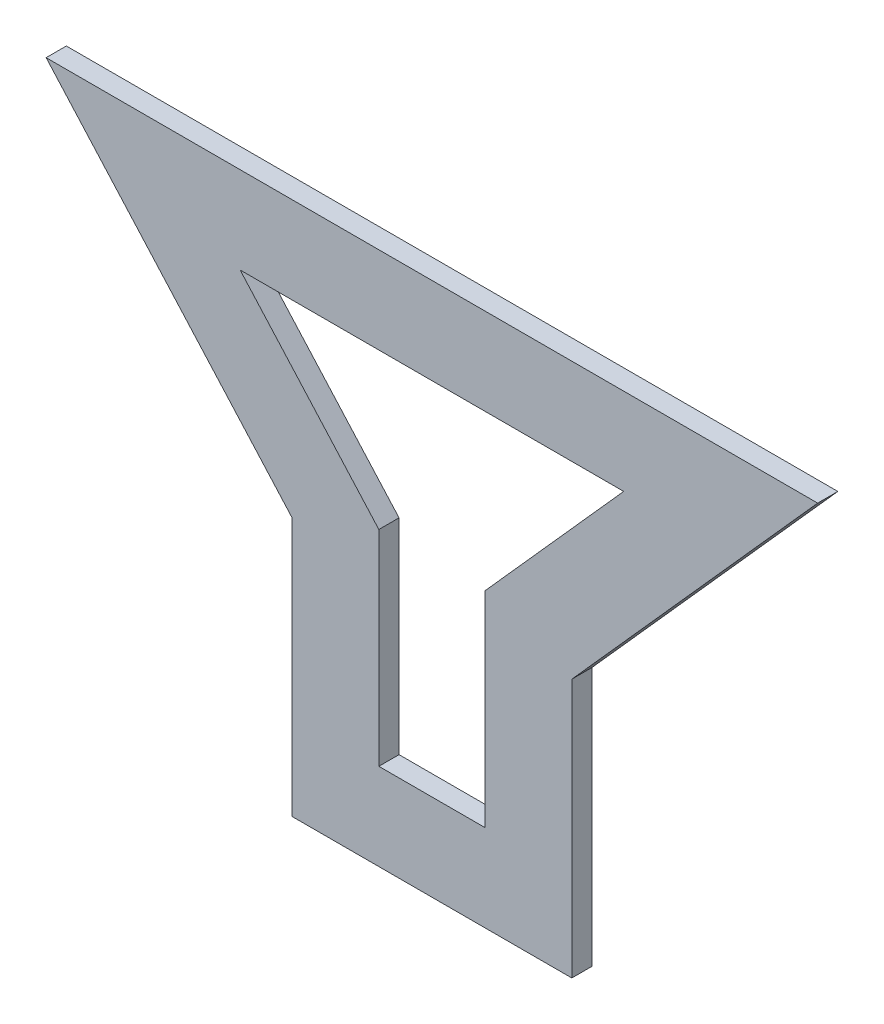
ISO-10303-21;
HEADER;
FILE_DESCRIPTION(('STEP AP214'),'2;1');
FILE_NAME('part.step','',(''),(''),'','','');
FILE_SCHEMA(('AUTOMOTIVE_DESIGN { 1 0 10303 214 1 1 1 1 }'));
ENDSEC;
DATA;
#1=APPLICATION_CONTEXT('core data for automotive mechanical design processes');
#2=APPLICATION_PROTOCOL_DEFINITION('international standard','automotive_design',2000,#1);
#3=PRODUCT_CONTEXT('',#1,'mechanical');
#4=PRODUCT('Part','Part','',(#3));
#5=PRODUCT_RELATED_PRODUCT_CATEGORY('part','',(#4));
#6=PRODUCT_DEFINITION_FORMATION('','',#4);
#7=PRODUCT_DEFINITION_CONTEXT('part definition',#1,'design');
#8=PRODUCT_DEFINITION('design','',#6,#7);
#9=PRODUCT_DEFINITION_SHAPE('','',#8);
#10=(LENGTH_UNIT() NAMED_UNIT(*) SI_UNIT(.MILLI.,.METRE.));
#11=(NAMED_UNIT(*) PLANE_ANGLE_UNIT() SI_UNIT($,.RADIAN.));
#12=(NAMED_UNIT(*) SI_UNIT($,.STERADIAN.) SOLID_ANGLE_UNIT());
#13=UNCERTAINTY_MEASURE_WITH_UNIT(LENGTH_MEASURE(1.E-05),#10,'distance_accuracy_value','');
#14=(GEOMETRIC_REPRESENTATION_CONTEXT(3) GLOBAL_UNCERTAINTY_ASSIGNED_CONTEXT((#13)) GLOBAL_UNIT_ASSIGNED_CONTEXT((#10,
#11,#12)) REPRESENTATION_CONTEXT('',''));
#15=CARTESIAN_POINT('',(0.,0.,0.));
#16=DIRECTION('',(0.,0.,1.));
#17=DIRECTION('',(1.,0.,0.));
#18=AXIS2_PLACEMENT_3D('',#15,#16,#17);
#19=CARTESIAN_POINT('',(0.,0.,10.));
#20=DIRECTION('',(0.,0.,-1.));
#21=DIRECTION('',(-1.,0.,0.));
#22=AXIS2_PLACEMENT_3D('',#19,#20,#21);
#23=PLANE('',#22);
#24=DIRECTION('',(0.,-1.,0.));
#25=VECTOR('',#24,1.);
#26=CARTESIAN_POINT('',(69.2702640138782,2.53280531523941,10.));
#27=LINE('',#26,#25);
#28=CARTESIAN_POINT('',(69.2702640138782,2.53280531523941,10.));
#29=VERTEX_POINT('',#28);
#30=CARTESIAN_POINT('',(69.2702640138782,-125.601784109811,10.));
#31=VERTEX_POINT('',#30);
#32=EDGE_CURVE('E236',#29,#31,#27,.T.);
#33=ORIENTED_EDGE('',*,*,#32,.F.);
#34=DIRECTION('',(0.665963027274692,0.745984749377042,0.));
#35=VECTOR('',#34,1.);
#36=CARTESIAN_POINT('',(69.2702640138782,2.53280531523941,10.));
#37=LINE('',#36,#35);
#38=CARTESIAN_POINT('',(190.995381487231,138.884340659251,10.));
#39=VERTEX_POINT('',#38);
#40=EDGE_CURVE('E255',#29,#39,#37,.T.);
#41=ORIENTED_EDGE('',*,*,#40,.T.);
#42=DIRECTION('',(-1.,0.,0.));
#43=VECTOR('',#42,1.);
#44=CARTESIAN_POINT('',(190.995381487231,138.884340659251,10.));
#45=LINE('',#44,#43);
#46=CARTESIAN_POINT('',(-190.995381487231,138.884340659251,10.));
#47=VERTEX_POINT('',#46);
#48=EDGE_CURVE('E252',#39,#47,#45,.T.);
#49=ORIENTED_EDGE('',*,*,#48,.T.);
#50=DIRECTION('',(-0.665963027274693,0.745984749377041,0.));
#51=VECTOR('',#50,1.);
#52=CARTESIAN_POINT('',(-69.2702640138782,2.5328053152393,10.));
#53=LINE('',#52,#51);
#54=CARTESIAN_POINT('',(-69.2702640138782,2.5328053152393,10.));
#55=VERTEX_POINT('',#54);
#56=EDGE_CURVE('E248',#55,#47,#53,.T.);
#57=ORIENTED_EDGE('',*,*,#56,.F.);
#58=DIRECTION('',(0.,-1.,0.));
#59=VECTOR('',#58,1.);
#60=CARTESIAN_POINT('',(-69.2702640138782,2.5328053152393,10.));
#61=LINE('',#60,#59);
#62=CARTESIAN_POINT('',(-69.2702640138782,-125.601784109811,10.));
#63=VERTEX_POINT('',#62);
#64=EDGE_CURVE('E245',#55,#63,#61,.T.);
#65=ORIENTED_EDGE('',*,*,#64,.T.);
#66=DIRECTION('',(-1.,0.,0.));
#67=VECTOR('',#66,1.);
#68=CARTESIAN_POINT('',(69.2702640138782,-125.601784109811,10.));
#69=LINE('',#68,#67);
#70=EDGE_CURVE('E240',#31,#63,#69,.T.);
#71=ORIENTED_EDGE('',*,*,#70,.F.);
#72=EDGE_LOOP('',(#33,#41,#49,#57,#65,#71));
#73=FACE_BOUND('',#72,.T.);
#74=DIRECTION('',(0.665963027274692,0.745984749377041,0.));
#75=VECTOR('',#74,1.);
#76=CARTESIAN_POINT('',(26.2702640138782,18.9340998758185,10.));
#77=LINE('',#76,#75);
#78=CARTESIAN_POINT('',(26.2702640138782,18.9340998758185,10.));
#79=VERTEX_POINT('',#78);
#80=CARTESIAN_POINT('',(94.9660588601479,95.8843406592509,10.));
#81=VERTEX_POINT('',#80);
#82=EDGE_CURVE('E166',#79,#81,#77,.T.);
#83=ORIENTED_EDGE('',*,*,#82,.F.);
#84=DIRECTION('',(0.,1.,0.));
#85=VECTOR('',#84,1.);
#86=CARTESIAN_POINT('',(26.2702640138782,-82.6017841098114,10.));
#87=LINE('',#86,#85);
#88=CARTESIAN_POINT('',(26.2702640138782,-82.6017841098114,10.));
#89=VERTEX_POINT('',#88);
#90=EDGE_CURVE('E202',#89,#79,#87,.T.);
#91=ORIENTED_EDGE('',*,*,#90,.F.);
#92=DIRECTION('',(1.,0.,0.));
#93=VECTOR('',#92,1.);
#94=CARTESIAN_POINT('',(-26.2702640138782,-82.6017841098114,10.));
#95=LINE('',#94,#93);
#96=CARTESIAN_POINT('',(-26.2702640138782,-82.6017841098114,10.));
#97=VERTEX_POINT('',#96);
#98=EDGE_CURVE('E199',#97,#89,#95,.T.);
#99=ORIENTED_EDGE('',*,*,#98,.F.);
#100=DIRECTION('',(0.,1.,0.));
#101=VECTOR('',#100,1.);
#102=CARTESIAN_POINT('',(-26.2702640138782,-82.6017841098114,10.));
#103=LINE('',#102,#101);
#104=CARTESIAN_POINT('',(-26.2702640138782,18.9340998758184,10.));
#105=VERTEX_POINT('',#104);
#106=EDGE_CURVE('E194',#97,#105,#103,.T.);
#107=ORIENTED_EDGE('',*,*,#106,.T.);
#108=DIRECTION('',(-0.665963027274692,0.745984749377041,0.));
#109=VECTOR('',#108,1.);
#110=CARTESIAN_POINT('',(-26.2702640138782,18.9340998758184,10.));
#111=LINE('',#110,#109);
#112=CARTESIAN_POINT('',(-94.9660588601479,95.8843406592508,10.));
#113=VERTEX_POINT('',#112);
#114=EDGE_CURVE('E190',#105,#113,#111,.T.);
#115=ORIENTED_EDGE('',*,*,#114,.T.);
#116=DIRECTION('',(-1.,0.,0.));
#117=VECTOR('',#116,1.);
#118=CARTESIAN_POINT('',(94.9660588601479,95.8843406592509,10.));
#119=LINE('',#118,#117);
#120=EDGE_CURVE('E175',#81,#113,#119,.T.);
#121=ORIENTED_EDGE('',*,*,#120,.F.);
#122=EDGE_LOOP('',(#83,#91,#99,#107,#115,#121));
#123=FACE_BOUND('',#122,.T.);
#124=ADVANCED_FACE('F75',(#73,#123),#23,.F.);
#125=CARTESIAN_POINT('',(0.,0.,0.));
#126=DIRECTION('',(0.,0.,-1.));
#127=DIRECTION('',(-1.,0.,0.));
#128=AXIS2_PLACEMENT_3D('',#125,#126,#127);
#129=PLANE('',#128);
#130=DIRECTION('',(0.,-1.,0.));
#131=VECTOR('',#130,1.);
#132=CARTESIAN_POINT('',(69.2702640138782,2.53280531523941,0.));
#133=LINE('',#132,#131);
#134=CARTESIAN_POINT('',(69.2702640138782,2.53280531523941,0.));
#135=VERTEX_POINT('',#134);
#136=CARTESIAN_POINT('',(69.2702640138782,-125.601784109811,0.));
#137=VERTEX_POINT('',#136);
#138=EDGE_CURVE('E184',#135,#137,#133,.T.);
#139=ORIENTED_EDGE('',*,*,#138,.T.);
#140=DIRECTION('',(-1.,0.,0.));
#141=VECTOR('',#140,1.);
#142=CARTESIAN_POINT('',(69.2702640138782,-125.601784109811,0.));
#143=LINE('',#142,#141);
#144=CARTESIAN_POINT('',(-69.2702640138782,-125.601784109811,0.));
#145=VERTEX_POINT('',#144);
#146=EDGE_CURVE('E261',#137,#145,#143,.T.);
#147=ORIENTED_EDGE('',*,*,#146,.T.);
#148=DIRECTION('',(0.,-1.,0.));
#149=VECTOR('',#148,1.);
#150=CARTESIAN_POINT('',(-69.2702640138782,2.5328053152393,0.));
#151=LINE('',#150,#149);
#152=CARTESIAN_POINT('',(-69.2702640138782,2.5328053152393,0.));
#153=VERTEX_POINT('',#152);
#154=EDGE_CURVE('E265',#153,#145,#151,.T.);
#155=ORIENTED_EDGE('',*,*,#154,.F.);
#156=DIRECTION('',(-0.665963027274693,0.745984749377041,0.));
#157=VECTOR('',#156,1.);
#158=CARTESIAN_POINT('',(-69.2702640138782,2.5328053152393,0.));
#159=LINE('',#158,#157);
#160=CARTESIAN_POINT('',(-190.995381487231,138.884340659251,0.));
#161=VERTEX_POINT('',#160);
#162=EDGE_CURVE('E269',#153,#161,#159,.T.);
#163=ORIENTED_EDGE('',*,*,#162,.T.);
#164=DIRECTION('',(-1.,0.,0.));
#165=VECTOR('',#164,1.);
#166=CARTESIAN_POINT('',(190.995381487231,138.884340659251,0.));
#167=LINE('',#166,#165);
#168=CARTESIAN_POINT('',(190.995381487231,138.884340659251,0.));
#169=VERTEX_POINT('',#168);
#170=EDGE_CURVE('E273',#169,#161,#167,.T.);
#171=ORIENTED_EDGE('',*,*,#170,.F.);
#172=DIRECTION('',(0.665963027274692,0.745984749377042,0.));
#173=VECTOR('',#172,1.);
#174=CARTESIAN_POINT('',(69.2702640138782,2.53280531523941,0.));
#175=LINE('',#174,#173);
#176=EDGE_CURVE('E241',#135,#169,#175,.T.);
#177=ORIENTED_EDGE('',*,*,#176,.F.);
#178=EDGE_LOOP('',(#139,#147,#155,#163,#171,#177));
#179=FACE_BOUND('',#178,.T.);
#180=DIRECTION('',(0.,1.,0.));
#181=VECTOR('',#180,1.);
#182=CARTESIAN_POINT('',(26.2702640138782,-82.6017841098114,0.));
#183=LINE('',#182,#181);
#184=CARTESIAN_POINT('',(26.2702640138782,-82.6017841098114,0.));
#185=VERTEX_POINT('',#184);
#186=CARTESIAN_POINT('',(26.2702640138782,18.9340998758185,0.));
#187=VERTEX_POINT('',#186);
#188=EDGE_CURVE('E176',#185,#187,#183,.T.);
#189=ORIENTED_EDGE('',*,*,#188,.T.);
#190=DIRECTION('',(0.665963027274692,0.745984749377041,0.));
#191=VECTOR('',#190,1.);
#192=CARTESIAN_POINT('',(26.2702640138782,18.9340998758185,0.));
#193=LINE('',#192,#191);
#194=CARTESIAN_POINT('',(94.9660588601479,95.8843406592509,0.));
#195=VERTEX_POINT('',#194);
#196=EDGE_CURVE('E101',#187,#195,#193,.T.);
#197=ORIENTED_EDGE('',*,*,#196,.T.);
#198=DIRECTION('',(-1.,0.,0.));
#199=VECTOR('',#198,1.);
#200=CARTESIAN_POINT('',(94.9660588601479,95.8843406592509,0.));
#201=LINE('',#200,#199);
#202=CARTESIAN_POINT('',(-94.9660588601479,95.8843406592508,0.));
#203=VERTEX_POINT('',#202);
#204=EDGE_CURVE('E182',#195,#203,#201,.T.);
#205=ORIENTED_EDGE('',*,*,#204,.T.);
#206=DIRECTION('',(-0.665963027274692,0.745984749377041,0.));
#207=VECTOR('',#206,1.);
#208=CARTESIAN_POINT('',(-26.2702640138782,18.9340998758184,0.));
#209=LINE('',#208,#207);
#210=CARTESIAN_POINT('',(-26.2702640138782,18.9340998758184,0.));
#211=VERTEX_POINT('',#210);
#212=EDGE_CURVE('E209',#211,#203,#209,.T.);
#213=ORIENTED_EDGE('',*,*,#212,.F.);
#214=DIRECTION('',(0.,1.,0.));
#215=VECTOR('',#214,1.);
#216=CARTESIAN_POINT('',(-26.2702640138782,-82.6017841098114,0.));
#217=LINE('',#216,#215);
#218=CARTESIAN_POINT('',(-26.2702640138782,-82.6017841098114,0.));
#219=VERTEX_POINT('',#218);
#220=EDGE_CURVE('E213',#219,#211,#217,.T.);
#221=ORIENTED_EDGE('',*,*,#220,.F.);
#222=DIRECTION('',(1.,0.,0.));
#223=VECTOR('',#222,1.);
#224=CARTESIAN_POINT('',(-26.2702640138782,-82.6017841098114,0.));
#225=LINE('',#224,#223);
#226=EDGE_CURVE('E217',#219,#185,#225,.T.);
#227=ORIENTED_EDGE('',*,*,#226,.T.);
#228=EDGE_LOOP('',(#189,#197,#205,#213,#221,#227));
#229=FACE_BOUND('',#228,.T.);
#230=ADVANCED_FACE('F301',(#179,#229),#129,.T.);
#231=CARTESIAN_POINT('',(69.2702640138782,2.53280531523941,10.));
#232=DIRECTION('',(1.,0.,0.));
#233=DIRECTION('',(0.,1.,0.));
#234=AXIS2_PLACEMENT_3D('',#231,#232,#233);
#235=PLANE('',#234);
#236=ORIENTED_EDGE('',*,*,#138,.F.);
#237=DIRECTION('',(0.,0.,-1.));
#238=VECTOR('',#237,1.);
#239=CARTESIAN_POINT('',(69.2702640138782,2.53280531523941,10.));
#240=LINE('',#239,#238);
#241=EDGE_CURVE('E12',#29,#135,#240,.T.);
#242=ORIENTED_EDGE('',*,*,#241,.F.);
#243=ORIENTED_EDGE('',*,*,#32,.T.);
#244=DIRECTION('',(0.,0.,-1.));
#245=VECTOR('',#244,1.);
#246=CARTESIAN_POINT('',(69.2702640138782,-125.601784109811,10.));
#247=LINE('',#246,#245);
#248=EDGE_CURVE('E79',#31,#137,#247,.T.);
#249=ORIENTED_EDGE('',*,*,#248,.T.);
#250=EDGE_LOOP('',(#236,#242,#243,#249));
#251=FACE_BOUND('',#250,.T.);
#252=ADVANCED_FACE('F77',(#251),#235,.T.);
#253=CARTESIAN_POINT('',(69.2702640138782,2.53280531523941,10.));
#254=DIRECTION('',(-0.745984749377042,0.665963027274692,0.));
#255=DIRECTION('',(-0.665963027274692,-0.745984749377042,0.));
#256=AXIS2_PLACEMENT_3D('',#253,#254,#255);
#257=PLANE('',#256);
#258=ORIENTED_EDGE('',*,*,#176,.T.);
#259=DIRECTION('',(0.,0.,-1.));
#260=VECTOR('',#259,1.);
#261=CARTESIAN_POINT('',(190.995381487231,138.884340659251,10.));
#262=LINE('',#261,#260);
#263=EDGE_CURVE('E85',#39,#169,#262,.T.);
#264=ORIENTED_EDGE('',*,*,#263,.F.);
#265=ORIENTED_EDGE('',*,*,#40,.F.);
#266=ORIENTED_EDGE('',*,*,#241,.T.);
#267=EDGE_LOOP('',(#258,#264,#265,#266));
#268=FACE_BOUND('',#267,.T.);
#269=ADVANCED_FACE('F306',(#268),#257,.F.);
#270=CARTESIAN_POINT('',(190.995381487231,138.884340659251,10.));
#271=DIRECTION('',(0.,-1.,0.));
#272=DIRECTION('',(1.,0.,0.));
#273=AXIS2_PLACEMENT_3D('',#270,#271,#272);
#274=PLANE('',#273);
#275=ORIENTED_EDGE('',*,*,#170,.T.);
#276=DIRECTION('',(0.,0.,-1.));
#277=VECTOR('',#276,1.);
#278=CARTESIAN_POINT('',(-190.995381487231,138.884340659251,10.));
#279=LINE('',#278,#277);
#280=EDGE_CURVE('E282',#47,#161,#279,.T.);
#281=ORIENTED_EDGE('',*,*,#280,.F.);
#282=ORIENTED_EDGE('',*,*,#48,.F.);
#283=ORIENTED_EDGE('',*,*,#263,.T.);
#284=EDGE_LOOP('',(#275,#281,#282,#283));
#285=FACE_BOUND('',#284,.T.);
#286=ADVANCED_FACE('F310',(#285),#274,.F.);
#287=CARTESIAN_POINT('',(-69.2702640138782,2.5328053152393,10.));
#288=DIRECTION('',(-0.745984749377041,-0.665963027274693,0.));
#289=DIRECTION('',(0.665963027274693,-0.745984749377041,0.));
#290=AXIS2_PLACEMENT_3D('',#287,#288,#289);
#291=PLANE('',#290);
#292=ORIENTED_EDGE('',*,*,#162,.F.);
#293=DIRECTION('',(0.,0.,-1.));
#294=VECTOR('',#293,1.);
#295=CARTESIAN_POINT('',(-69.2702640138782,2.5328053152393,10.));
#296=LINE('',#295,#294);
#297=EDGE_CURVE('E285',#55,#153,#296,.T.);
#298=ORIENTED_EDGE('',*,*,#297,.F.);
#299=ORIENTED_EDGE('',*,*,#56,.T.);
#300=ORIENTED_EDGE('',*,*,#280,.T.);
#301=EDGE_LOOP('',(#292,#298,#299,#300));
#302=FACE_BOUND('',#301,.T.);
#303=ADVANCED_FACE('F319',(#302),#291,.T.);
#304=CARTESIAN_POINT('',(-69.2702640138782,2.5328053152393,10.));
#305=DIRECTION('',(1.,0.,0.));
#306=DIRECTION('',(0.,1.,0.));
#307=AXIS2_PLACEMENT_3D('',#304,#305,#306);
#308=PLANE('',#307);
#309=ORIENTED_EDGE('',*,*,#154,.T.);
#310=DIRECTION('',(0.,0.,-1.));
#311=VECTOR('',#310,1.);
#312=CARTESIAN_POINT('',(-69.2702640138782,-125.601784109811,10.));
#313=LINE('',#312,#311);
#314=EDGE_CURVE('E287',#63,#145,#313,.T.);
#315=ORIENTED_EDGE('',*,*,#314,.F.);
#316=ORIENTED_EDGE('',*,*,#64,.F.);
#317=ORIENTED_EDGE('',*,*,#297,.T.);
#318=EDGE_LOOP('',(#309,#315,#316,#317));
#319=FACE_BOUND('',#318,.T.);
#320=ADVANCED_FACE('F316',(#319),#308,.F.);
#321=CARTESIAN_POINT('',(69.2702640138782,-125.601784109811,10.));
#322=DIRECTION('',(0.,-1.,0.));
#323=DIRECTION('',(0.,0.,-1.));
#324=AXIS2_PLACEMENT_3D('',#321,#322,#323);
#325=PLANE('',#324);
#326=ORIENTED_EDGE('',*,*,#146,.F.);
#327=ORIENTED_EDGE('',*,*,#248,.F.);
#328=ORIENTED_EDGE('',*,*,#70,.T.);
#329=ORIENTED_EDGE('',*,*,#314,.T.);
#330=EDGE_LOOP('',(#326,#327,#328,#329));
#331=FACE_BOUND('',#330,.T.);
#332=ADVANCED_FACE('F297',(#331),#325,.T.);
#333=CARTESIAN_POINT('',(26.2702640138782,18.9340998758185,10.));
#334=DIRECTION('',(-0.745984749377041,0.665963027274692,0.));
#335=DIRECTION('',(-0.665963027274692,-0.745984749377042,0.));
#336=AXIS2_PLACEMENT_3D('',#333,#334,#335);
#337=PLANE('',#336);
#338=ORIENTED_EDGE('',*,*,#196,.F.);
#339=DIRECTION('',(0.,0.,-1.));
#340=VECTOR('',#339,1.);
#341=CARTESIAN_POINT('',(26.2702640138782,18.9340998758185,10.));
#342=LINE('',#341,#340);
#343=EDGE_CURVE('E170',#79,#187,#342,.T.);
#344=ORIENTED_EDGE('',*,*,#343,.F.);
#345=ORIENTED_EDGE('',*,*,#82,.T.);
#346=DIRECTION('',(0.,0.,-1.));
#347=VECTOR('',#346,1.);
#348=CARTESIAN_POINT('',(94.9660588601479,95.8843406592509,10.));
#349=LINE('',#348,#347);
#350=EDGE_CURVE('E169',#81,#195,#349,.T.);
#351=ORIENTED_EDGE('',*,*,#350,.T.);
#352=EDGE_LOOP('',(#338,#344,#345,#351));
#353=FACE_BOUND('',#352,.T.);
#354=ADVANCED_FACE('F168',(#353),#337,.T.);
#355=CARTESIAN_POINT('',(94.9660588601479,95.8843406592509,10.));
#356=DIRECTION('',(0.,-1.,0.));
#357=DIRECTION('',(1.,0.,0.));
#358=AXIS2_PLACEMENT_3D('',#355,#356,#357);
#359=PLANE('',#358);
#360=ORIENTED_EDGE('',*,*,#204,.F.);
#361=ORIENTED_EDGE('',*,*,#350,.F.);
#362=ORIENTED_EDGE('',*,*,#120,.T.);
#363=DIRECTION('',(0.,0.,-1.));
#364=VECTOR('',#363,1.);
#365=CARTESIAN_POINT('',(-94.9660588601479,95.8843406592508,10.));
#366=LINE('',#365,#364);
#367=EDGE_CURVE('E185',#113,#203,#366,.T.);
#368=ORIENTED_EDGE('',*,*,#367,.T.);
#369=EDGE_LOOP('',(#360,#361,#362,#368));
#370=FACE_BOUND('',#369,.T.);
#371=ADVANCED_FACE('F179',(#370),#359,.T.);
#372=CARTESIAN_POINT('',(-26.2702640138782,18.9340998758184,10.));
#373=DIRECTION('',(-0.745984749377041,-0.665963027274692,0.));
#374=DIRECTION('',(0.665963027274692,-0.745984749377042,0.));
#375=AXIS2_PLACEMENT_3D('',#372,#373,#374);
#376=PLANE('',#375);
#377=ORIENTED_EDGE('',*,*,#212,.T.);
#378=ORIENTED_EDGE('',*,*,#367,.F.);
#379=ORIENTED_EDGE('',*,*,#114,.F.);
#380=DIRECTION('',(0.,0.,-1.));
#381=VECTOR('',#380,1.);
#382=CARTESIAN_POINT('',(-26.2702640138782,18.9340998758184,10.));
#383=LINE('',#382,#381);
#384=EDGE_CURVE('E231',#105,#211,#383,.T.);
#385=ORIENTED_EDGE('',*,*,#384,.T.);
#386=EDGE_LOOP('',(#377,#378,#379,#385));
#387=FACE_BOUND('',#386,.T.);
#388=ADVANCED_FACE('F393',(#387),#376,.F.);
#389=CARTESIAN_POINT('',(-26.2702640138782,-82.6017841098114,10.));
#390=DIRECTION('',(-1.,0.,0.));
#391=DIRECTION('',(0.,0.,1.));
#392=AXIS2_PLACEMENT_3D('',#389,#390,#391);
#393=PLANE('',#392);
#394=ORIENTED_EDGE('',*,*,#220,.T.);
#395=ORIENTED_EDGE('',*,*,#384,.F.);
#396=ORIENTED_EDGE('',*,*,#106,.F.);
#397=DIRECTION('',(0.,0.,-1.));
#398=VECTOR('',#397,1.);
#399=CARTESIAN_POINT('',(-26.2702640138782,-82.6017841098114,10.));
#400=LINE('',#399,#398);
#401=EDGE_CURVE('E228',#97,#219,#400,.T.);
#402=ORIENTED_EDGE('',*,*,#401,.T.);
#403=EDGE_LOOP('',(#394,#395,#396,#402));
#404=FACE_BOUND('',#403,.T.);
#405=ADVANCED_FACE('F400',(#404),#393,.F.);
#406=CARTESIAN_POINT('',(-26.2702640138782,-82.6017841098114,10.));
#407=DIRECTION('',(0.,1.,0.));
#408=DIRECTION('',(-1.,0.,0.));
#409=AXIS2_PLACEMENT_3D('',#406,#407,#408);
#410=PLANE('',#409);
#411=ORIENTED_EDGE('',*,*,#226,.F.);
#412=ORIENTED_EDGE('',*,*,#401,.F.);
#413=ORIENTED_EDGE('',*,*,#98,.T.);
#414=DIRECTION('',(0.,0.,-1.));
#415=VECTOR('',#414,1.);
#416=CARTESIAN_POINT('',(26.2702640138782,-82.6017841098114,10.));
#417=LINE('',#416,#415);
#418=EDGE_CURVE('E93',#89,#185,#417,.T.);
#419=ORIENTED_EDGE('',*,*,#418,.T.);
#420=EDGE_LOOP('',(#411,#412,#413,#419));
#421=FACE_BOUND('',#420,.T.);
#422=ADVANCED_FACE('F409',(#421),#410,.T.);
#423=CARTESIAN_POINT('',(26.2702640138782,-82.6017841098114,10.));
#424=DIRECTION('',(-1.,0.,0.));
#425=DIRECTION('',(0.,0.,1.));
#426=AXIS2_PLACEMENT_3D('',#423,#424,#425);
#427=PLANE('',#426);
#428=ORIENTED_EDGE('',*,*,#188,.F.);
#429=ORIENTED_EDGE('',*,*,#418,.F.);
#430=ORIENTED_EDGE('',*,*,#90,.T.);
#431=ORIENTED_EDGE('',*,*,#343,.T.);
#432=EDGE_LOOP('',(#428,#429,#430,#431));
#433=FACE_BOUND('',#432,.T.);
#434=ADVANCED_FACE('F418',(#433),#427,.T.);
#435=CLOSED_SHELL('',(#124,#230,#252,#269,#286,#303,#320,#332,#354,#371,#388,#405,#422,#434));
#436=MANIFOLD_SOLID_BREP('B2',#435);
#437=ADVANCED_BREP_SHAPE_REPRESENTATION('',(#18,#436),#14);
#438=SHAPE_DEFINITION_REPRESENTATION(#9,#437);
ENDSEC;
END-ISO-10303-21;
